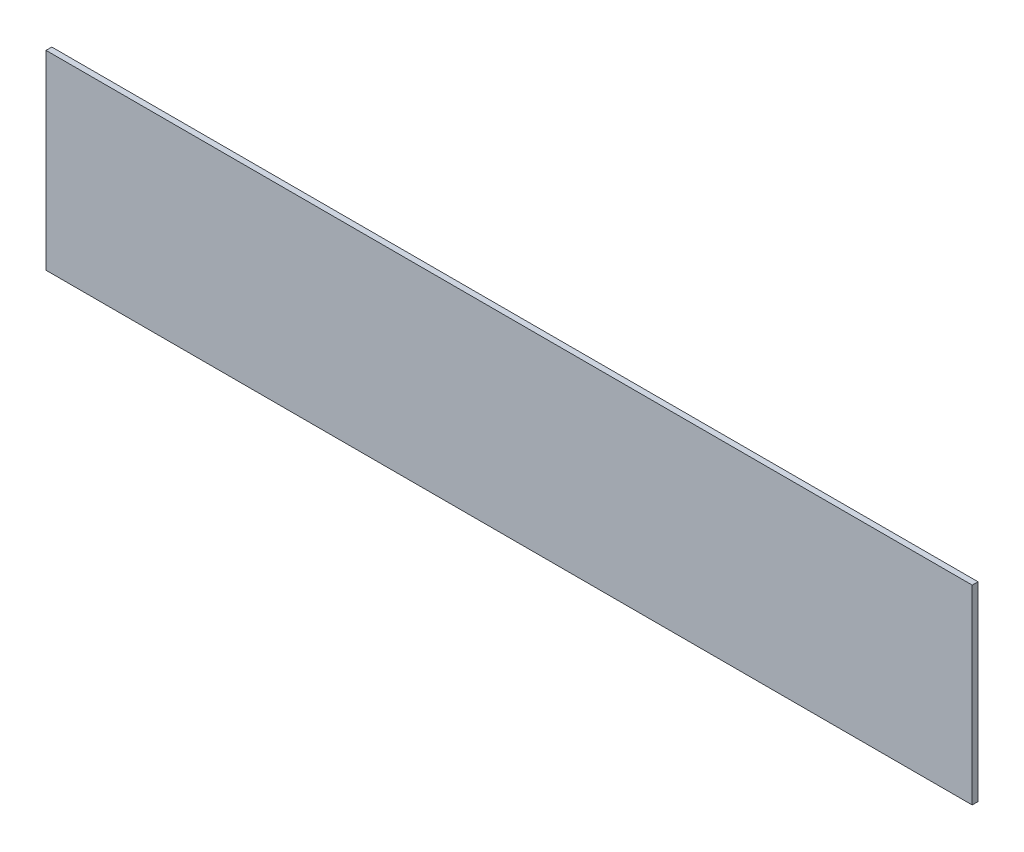
ISO-10303-21;
HEADER;
FILE_DESCRIPTION(('STEP AP214'),'2;1');
FILE_NAME('part.step','',(''),(''),'','','');
FILE_SCHEMA(('AUTOMOTIVE_DESIGN { 1 0 10303 214 1 1 1 1 }'));
ENDSEC;
DATA;
#1=APPLICATION_CONTEXT('core data for automotive mechanical design processes');
#2=APPLICATION_PROTOCOL_DEFINITION('international standard','automotive_design',2000,#1);
#3=PRODUCT_CONTEXT('',#1,'mechanical');
#4=PRODUCT('Part','Part','',(#3));
#5=PRODUCT_RELATED_PRODUCT_CATEGORY('part','',(#4));
#6=PRODUCT_DEFINITION_FORMATION('','',#4);
#7=PRODUCT_DEFINITION_CONTEXT('part definition',#1,'design');
#8=PRODUCT_DEFINITION('design','',#6,#7);
#9=PRODUCT_DEFINITION_SHAPE('','',#8);
#10=(LENGTH_UNIT() NAMED_UNIT(*) SI_UNIT(.MILLI.,.METRE.));
#11=(NAMED_UNIT(*) PLANE_ANGLE_UNIT() SI_UNIT($,.RADIAN.));
#12=(NAMED_UNIT(*) SI_UNIT($,.STERADIAN.) SOLID_ANGLE_UNIT());
#13=UNCERTAINTY_MEASURE_WITH_UNIT(LENGTH_MEASURE(1.E-05),#10,'distance_accuracy_value','');
#14=(GEOMETRIC_REPRESENTATION_CONTEXT(3) GLOBAL_UNCERTAINTY_ASSIGNED_CONTEXT((#13)) GLOBAL_UNIT_ASSIGNED_CONTEXT((#10,
#11,#12)) REPRESENTATION_CONTEXT('',''));
#15=CARTESIAN_POINT('',(0.,0.,0.));
#16=DIRECTION('',(0.,0.,1.));
#17=DIRECTION('',(1.,0.,0.));
#18=AXIS2_PLACEMENT_3D('',#15,#16,#17);
#19=CARTESIAN_POINT('',(-46.6125846249164,-26.6194417098174,1.27));
#20=DIRECTION('',(1.,0.,0.));
#21=DIRECTION('',(0.,0.,-1.));
#22=AXIS2_PLACEMENT_3D('',#19,#20,#21);
#23=PLANE('',#22);
#24=DIRECTION('',(0.,-1.,0.));
#25=VECTOR('',#24,1.);
#26=CARTESIAN_POINT('',(-46.6125846249164,-26.6194417098174,0.));
#27=LINE('',#26,#25);
#28=CARTESIAN_POINT('',(-46.6125846249164,15.1635582901826,0.));
#29=VERTEX_POINT('',#28);
#30=CARTESIAN_POINT('',(-46.6125846249164,-26.6194417098174,0.));
#31=VERTEX_POINT('',#30);
#32=EDGE_CURVE('E96',#29,#31,#27,.T.);
#33=ORIENTED_EDGE('',*,*,#32,.T.);
#34=DIRECTION('',(0.,0.,-1.));
#35=VECTOR('',#34,1.);
#36=CARTESIAN_POINT('',(-46.6125846249164,-26.6194417098174,1.27));
#37=LINE('',#36,#35);
#38=CARTESIAN_POINT('',(-46.6125846249164,-26.6194417098174,1.27));
#39=VERTEX_POINT('',#38);
#40=EDGE_CURVE('E11',#39,#31,#37,.T.);
#41=ORIENTED_EDGE('',*,*,#40,.F.);
#42=DIRECTION('',(0.,-1.,0.));
#43=VECTOR('',#42,1.);
#44=CARTESIAN_POINT('',(-46.6125846249164,-26.6194417098174,1.27));
#45=LINE('',#44,#43);
#46=CARTESIAN_POINT('',(-46.6125846249164,15.1635582901826,1.27));
#47=VERTEX_POINT('',#46);
#48=EDGE_CURVE('E84',#47,#39,#45,.T.);
#49=ORIENTED_EDGE('',*,*,#48,.F.);
#50=DIRECTION('',(0.,0.,-1.));
#51=VECTOR('',#50,1.);
#52=CARTESIAN_POINT('',(-46.6125846249164,15.1635582901826,1.27));
#53=LINE('',#52,#51);
#54=EDGE_CURVE('E92',#47,#29,#53,.T.);
#55=ORIENTED_EDGE('',*,*,#54,.T.);
#56=EDGE_LOOP('',(#33,#41,#49,#55));
#57=FACE_BOUND('',#56,.T.);
#58=ADVANCED_FACE('F33',(#57),#23,.F.);
#59=CARTESIAN_POINT('',(-46.6125846249164,-26.6194417098174,1.27));
#60=DIRECTION('',(0.,1.,0.));
#61=DIRECTION('',(0.,0.,1.));
#62=AXIS2_PLACEMENT_3D('',#59,#60,#61);
#63=PLANE('',#62);
#64=DIRECTION('',(1.,0.,0.));
#65=VECTOR('',#64,1.);
#66=CARTESIAN_POINT('',(-46.6125846249164,-26.6194417098174,0.));
#67=LINE('',#66,#65);
#68=CARTESIAN_POINT('',(156.587415375084,-26.6194417098174,0.));
#69=VERTEX_POINT('',#68);
#70=EDGE_CURVE('E88',#31,#69,#67,.T.);
#71=ORIENTED_EDGE('',*,*,#70,.T.);
#72=DIRECTION('',(0.,0.,-1.));
#73=VECTOR('',#72,1.);
#74=CARTESIAN_POINT('',(156.587415375084,-26.6194417098174,1.27));
#75=LINE('',#74,#73);
#76=CARTESIAN_POINT('',(156.587415375084,-26.6194417098174,1.27));
#77=VERTEX_POINT('',#76);
#78=EDGE_CURVE('E41',#77,#69,#75,.T.);
#79=ORIENTED_EDGE('',*,*,#78,.F.);
#80=DIRECTION('',(1.,0.,0.));
#81=VECTOR('',#80,1.);
#82=CARTESIAN_POINT('',(-46.6125846249164,-26.6194417098174,1.27));
#83=LINE('',#82,#81);
#84=EDGE_CURVE('E79',#39,#77,#83,.T.);
#85=ORIENTED_EDGE('',*,*,#84,.F.);
#86=ORIENTED_EDGE('',*,*,#40,.T.);
#87=EDGE_LOOP('',(#71,#79,#85,#86));
#88=FACE_BOUND('',#87,.T.);
#89=ADVANCED_FACE('F87',(#88),#63,.F.);
#90=CARTESIAN_POINT('',(156.587415375084,-26.6194417098174,1.27));
#91=DIRECTION('',(-1.,0.,0.));
#92=DIRECTION('',(0.,0.,1.));
#93=AXIS2_PLACEMENT_3D('',#90,#91,#92);
#94=PLANE('',#93);
#95=DIRECTION('',(0.,1.,0.));
#96=VECTOR('',#95,1.);
#97=CARTESIAN_POINT('',(156.587415375084,-26.6194417098174,0.));
#98=LINE('',#97,#96);
#99=CARTESIAN_POINT('',(156.587415375084,15.1635582901826,0.));
#100=VERTEX_POINT('',#99);
#101=EDGE_CURVE('E66',#69,#100,#98,.T.);
#102=ORIENTED_EDGE('',*,*,#101,.T.);
#103=DIRECTION('',(0.,0.,-1.));
#104=VECTOR('',#103,1.);
#105=CARTESIAN_POINT('',(156.587415375084,15.1635582901826,1.27));
#106=LINE('',#105,#104);
#107=CARTESIAN_POINT('',(156.587415375084,15.1635582901826,1.27));
#108=VERTEX_POINT('',#107);
#109=EDGE_CURVE('E89',#108,#100,#106,.T.);
#110=ORIENTED_EDGE('',*,*,#109,.F.);
#111=DIRECTION('',(0.,1.,0.));
#112=VECTOR('',#111,1.);
#113=CARTESIAN_POINT('',(156.587415375084,-26.6194417098174,1.27));
#114=LINE('',#113,#112);
#115=EDGE_CURVE('E82',#77,#108,#114,.T.);
#116=ORIENTED_EDGE('',*,*,#115,.F.);
#117=ORIENTED_EDGE('',*,*,#78,.T.);
#118=EDGE_LOOP('',(#102,#110,#116,#117));
#119=FACE_BOUND('',#118,.T.);
#120=ADVANCED_FACE('F90',(#119),#94,.F.);
#121=CARTESIAN_POINT('',(-46.6125846249164,15.1635582901826,1.27));
#122=DIRECTION('',(0.,-1.,0.));
#123=DIRECTION('',(0.,0.,-1.));
#124=AXIS2_PLACEMENT_3D('',#121,#122,#123);
#125=PLANE('',#124);
#126=DIRECTION('',(-1.,0.,0.));
#127=VECTOR('',#126,1.);
#128=CARTESIAN_POINT('',(-46.6125846249164,15.1635582901826,0.));
#129=LINE('',#128,#127);
#130=EDGE_CURVE('E72',#100,#29,#129,.T.);
#131=ORIENTED_EDGE('',*,*,#130,.T.);
#132=ORIENTED_EDGE('',*,*,#54,.F.);
#133=DIRECTION('',(-1.,0.,0.));
#134=VECTOR('',#133,1.);
#135=CARTESIAN_POINT('',(-46.6125846249164,15.1635582901826,1.27));
#136=LINE('',#135,#134);
#137=EDGE_CURVE('E49',#108,#47,#136,.T.);
#138=ORIENTED_EDGE('',*,*,#137,.F.);
#139=ORIENTED_EDGE('',*,*,#109,.T.);
#140=EDGE_LOOP('',(#131,#132,#138,#139));
#141=FACE_BOUND('',#140,.T.);
#142=ADVANCED_FACE('F103',(#141),#125,.F.);
#143=CARTESIAN_POINT('',(0.,0.,1.27));
#144=DIRECTION('',(0.,0.,-1.));
#145=DIRECTION('',(-1.,0.,0.));
#146=AXIS2_PLACEMENT_3D('',#143,#144,#145);
#147=PLANE('',#146);
#148=ORIENTED_EDGE('',*,*,#48,.T.);
#149=ORIENTED_EDGE('',*,*,#84,.T.);
#150=ORIENTED_EDGE('',*,*,#115,.T.);
#151=ORIENTED_EDGE('',*,*,#137,.T.);
#152=EDGE_LOOP('',(#148,#149,#150,#151));
#153=FACE_BOUND('',#152,.T.);
#154=ADVANCED_FACE('F80',(#153),#147,.F.);
#155=CARTESIAN_POINT('',(0.,0.,0.));
#156=DIRECTION('',(0.,0.,-1.));
#157=DIRECTION('',(-1.,0.,0.));
#158=AXIS2_PLACEMENT_3D('',#155,#156,#157);
#159=PLANE('',#158);
#160=ORIENTED_EDGE('',*,*,#32,.F.);
#161=ORIENTED_EDGE('',*,*,#130,.F.);
#162=ORIENTED_EDGE('',*,*,#101,.F.);
#163=ORIENTED_EDGE('',*,*,#70,.F.);
#164=EDGE_LOOP('',(#160,#161,#162,#163));
#165=FACE_BOUND('',#164,.T.);
#166=ADVANCED_FACE('F106',(#165),#159,.T.);
#167=CLOSED_SHELL('',(#58,#89,#120,#142,#154,#166));
#168=MANIFOLD_SOLID_BREP('B2',#167);
#169=ADVANCED_BREP_SHAPE_REPRESENTATION('',(#18,#168),#14);
#170=SHAPE_DEFINITION_REPRESENTATION(#9,#169);
ENDSEC;
END-ISO-10303-21;
